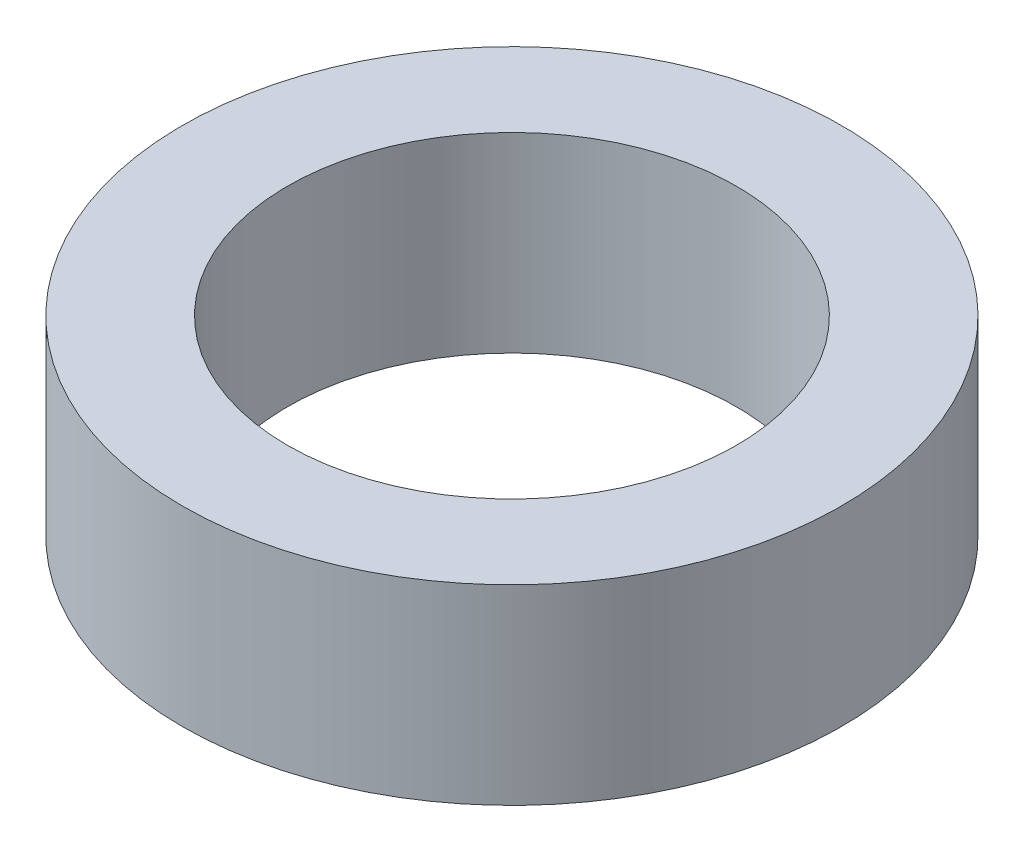
ISO-10303-21;
HEADER;
FILE_DESCRIPTION(('STEP AP214'),'2;1');
FILE_NAME('part.step','',(''),(''),'','','');
FILE_SCHEMA(('AUTOMOTIVE_DESIGN { 1 0 10303 214 1 1 1 1 }'));
ENDSEC;
DATA;
#1=APPLICATION_CONTEXT('core data for automotive mechanical design processes');
#2=APPLICATION_PROTOCOL_DEFINITION('international standard','automotive_design',2000,#1);
#3=PRODUCT_CONTEXT('',#1,'mechanical');
#4=PRODUCT('Part','Part','',(#3));
#5=PRODUCT_RELATED_PRODUCT_CATEGORY('part','',(#4));
#6=PRODUCT_DEFINITION_FORMATION('','',#4);
#7=PRODUCT_DEFINITION_CONTEXT('part definition',#1,'design');
#8=PRODUCT_DEFINITION('design','',#6,#7);
#9=PRODUCT_DEFINITION_SHAPE('','',#8);
#10=(LENGTH_UNIT() NAMED_UNIT(*) SI_UNIT(.MILLI.,.METRE.));
#11=(NAMED_UNIT(*) PLANE_ANGLE_UNIT() SI_UNIT($,.RADIAN.));
#12=(NAMED_UNIT(*) SI_UNIT($,.STERADIAN.) SOLID_ANGLE_UNIT());
#13=UNCERTAINTY_MEASURE_WITH_UNIT(LENGTH_MEASURE(1.E-05),#10,'distance_accuracy_value','');
#14=(GEOMETRIC_REPRESENTATION_CONTEXT(3) GLOBAL_UNCERTAINTY_ASSIGNED_CONTEXT((#13)) GLOBAL_UNIT_ASSIGNED_CONTEXT((#10,
#11,#12)) REPRESENTATION_CONTEXT('',''));
#15=CARTESIAN_POINT('',(0.,0.,0.));
#16=DIRECTION('',(0.,0.,1.));
#17=DIRECTION('',(1.,0.,0.));
#18=AXIS2_PLACEMENT_3D('',#15,#16,#17);
#19=CARTESIAN_POINT('',(0.,1.,0.));
#20=DIRECTION('',(0.,1.,0.));
#21=DIRECTION('',(0.,0.,1.));
#22=AXIS2_PLACEMENT_3D('',#19,#20,#21);
#23=PLANE('',#22);
#24=CARTESIAN_POINT('',(0.,1.,0.));
#25=DIRECTION('',(0.,1.,0.));
#26=DIRECTION('',(0.,0.,1.));
#27=AXIS2_PLACEMENT_3D('',#24,#25,#26);
#28=CIRCLE('',#27,1.725);
#29=CARTESIAN_POINT('',(0.,1.,1.725));
#30=VERTEX_POINT('',#29);
#31=EDGE_CURVE('E10',#30,#30,#28,.T.);
#32=ORIENTED_EDGE('',*,*,#31,.T.);
#33=EDGE_LOOP('',(#32));
#34=FACE_BOUND('',#33,.T.);
#35=CARTESIAN_POINT('',(0.,1.,0.));
#36=DIRECTION('',(0.,1.,0.));
#37=DIRECTION('',(0.,0.,1.));
#38=AXIS2_PLACEMENT_3D('',#35,#36,#37);
#39=CIRCLE('',#38,1.175);
#40=CARTESIAN_POINT('',(0.,1.,1.175));
#41=VERTEX_POINT('',#40);
#42=EDGE_CURVE('E42',#41,#41,#39,.T.);
#43=ORIENTED_EDGE('',*,*,#42,.F.);
#44=EDGE_LOOP('',(#43));
#45=FACE_BOUND('',#44,.T.);
#46=ADVANCED_FACE('F31',(#34,#45),#23,.T.);
#47=CARTESIAN_POINT('',(0.,0.,0.));
#48=DIRECTION('',(0.,1.,0.));
#49=DIRECTION('',(0.,0.,1.));
#50=AXIS2_PLACEMENT_3D('',#47,#48,#49);
#51=PLANE('',#50);
#52=CARTESIAN_POINT('',(0.,0.,0.));
#53=DIRECTION('',(0.,1.,0.));
#54=DIRECTION('',(0.,0.,1.));
#55=AXIS2_PLACEMENT_3D('',#52,#53,#54);
#56=CIRCLE('',#55,1.725);
#57=CARTESIAN_POINT('',(0.,0.,1.725));
#58=VERTEX_POINT('',#57);
#59=EDGE_CURVE('E35',#58,#58,#56,.T.);
#60=ORIENTED_EDGE('',*,*,#59,.F.);
#61=EDGE_LOOP('',(#60));
#62=FACE_BOUND('',#61,.T.);
#63=CARTESIAN_POINT('',(0.,0.,0.));
#64=DIRECTION('',(0.,1.,0.));
#65=DIRECTION('',(0.,0.,1.));
#66=AXIS2_PLACEMENT_3D('',#63,#64,#65);
#67=CIRCLE('',#66,1.175);
#68=CARTESIAN_POINT('',(0.,0.,1.175));
#69=VERTEX_POINT('',#68);
#70=EDGE_CURVE('E44',#69,#69,#67,.T.);
#71=ORIENTED_EDGE('',*,*,#70,.T.);
#72=EDGE_LOOP('',(#71));
#73=FACE_BOUND('',#72,.T.);
#74=ADVANCED_FACE('F54',(#62,#73),#51,.F.);
#75=CARTESIAN_POINT('',(0.,1.,0.));
#76=DIRECTION('',(0.,-1.,0.));
#77=DIRECTION('',(0.,0.,-1.));
#78=AXIS2_PLACEMENT_3D('',#75,#76,#77);
#79=CYLINDRICAL_SURFACE('',#78,1.725);
#80=ORIENTED_EDGE('',*,*,#31,.F.);
#81=EDGE_LOOP('',(#80));
#82=FACE_BOUND('',#81,.T.);
#83=ORIENTED_EDGE('',*,*,#59,.T.);
#84=EDGE_LOOP('',(#83));
#85=FACE_BOUND('',#84,.T.);
#86=ADVANCED_FACE('F33',(#82,#85),#79,.T.);
#87=CARTESIAN_POINT('',(0.,1.,0.));
#88=DIRECTION('',(0.,-1.,0.));
#89=DIRECTION('',(0.,0.,-1.));
#90=AXIS2_PLACEMENT_3D('',#87,#88,#89);
#91=CYLINDRICAL_SURFACE('',#90,1.175);
#92=ORIENTED_EDGE('',*,*,#42,.T.);
#93=EDGE_LOOP('',(#92));
#94=FACE_BOUND('',#93,.T.);
#95=ORIENTED_EDGE('',*,*,#70,.F.);
#96=EDGE_LOOP('',(#95));
#97=FACE_BOUND('',#96,.T.);
#98=ADVANCED_FACE('F50',(#94,#97),#91,.F.);
#99=CLOSED_SHELL('',(#46,#74,#86,#98));
#100=MANIFOLD_SOLID_BREP('B2',#99);
#101=ADVANCED_BREP_SHAPE_REPRESENTATION('',(#18,#100),#14);
#102=SHAPE_DEFINITION_REPRESENTATION(#9,#101);
ENDSEC;
END-ISO-10303-21;
